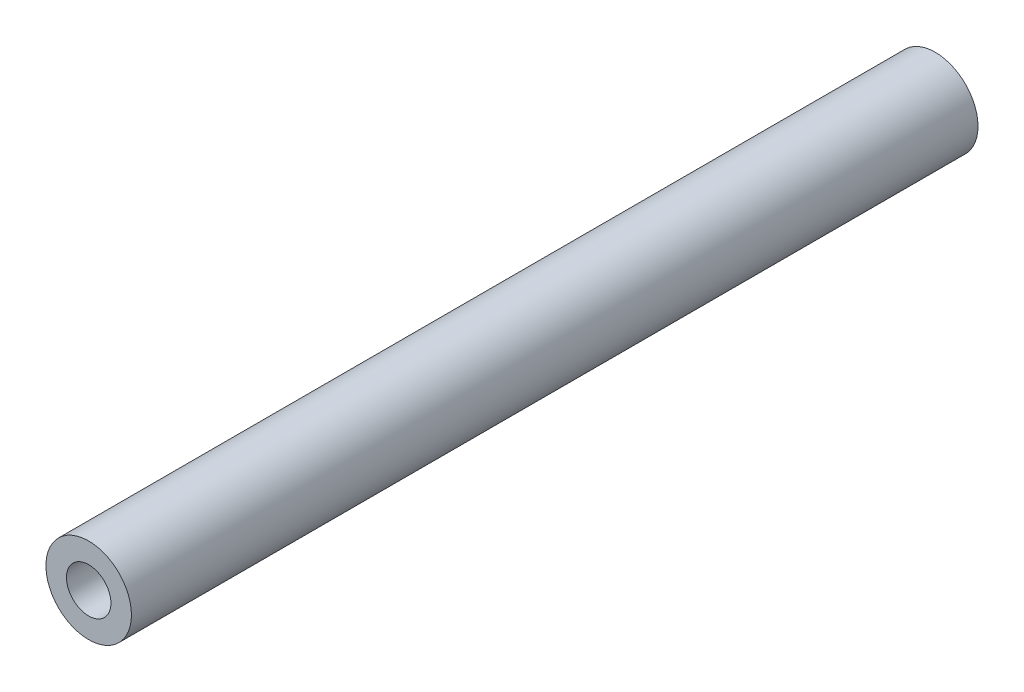
ISO-10303-21;
HEADER;
FILE_DESCRIPTION(('STEP AP214'),'2;1');
FILE_NAME('part.step','',(''),(''),'','','');
FILE_SCHEMA(('AUTOMOTIVE_DESIGN { 1 0 10303 214 1 1 1 1 }'));
ENDSEC;
DATA;
#1=APPLICATION_CONTEXT('core data for automotive mechanical design processes');
#2=APPLICATION_PROTOCOL_DEFINITION('international standard','automotive_design',2000,#1);
#3=PRODUCT_CONTEXT('',#1,'mechanical');
#4=PRODUCT('Part','Part','',(#3));
#5=PRODUCT_RELATED_PRODUCT_CATEGORY('part','',(#4));
#6=PRODUCT_DEFINITION_FORMATION('','',#4);
#7=PRODUCT_DEFINITION_CONTEXT('part definition',#1,'design');
#8=PRODUCT_DEFINITION('design','',#6,#7);
#9=PRODUCT_DEFINITION_SHAPE('','',#8);
#10=(LENGTH_UNIT() NAMED_UNIT(*) SI_UNIT(.MILLI.,.METRE.));
#11=(NAMED_UNIT(*) PLANE_ANGLE_UNIT() SI_UNIT($,.RADIAN.));
#12=(NAMED_UNIT(*) SI_UNIT($,.STERADIAN.) SOLID_ANGLE_UNIT());
#13=UNCERTAINTY_MEASURE_WITH_UNIT(LENGTH_MEASURE(1.E-05),#10,'distance_accuracy_value','');
#14=(GEOMETRIC_REPRESENTATION_CONTEXT(3) GLOBAL_UNCERTAINTY_ASSIGNED_CONTEXT((#13)) GLOBAL_UNIT_ASSIGNED_CONTEXT((#10,
#11,#12)) REPRESENTATION_CONTEXT('',''));
#15=CARTESIAN_POINT('',(0.,0.,0.));
#16=DIRECTION('',(0.,0.,1.));
#17=DIRECTION('',(1.,0.,0.));
#18=AXIS2_PLACEMENT_3D('',#15,#16,#17);
#19=CARTESIAN_POINT('',(0.,0.,49.5));
#20=DIRECTION('',(0.,0.,-1.));
#21=DIRECTION('',(-1.,0.,0.));
#22=AXIS2_PLACEMENT_3D('',#19,#20,#21);
#23=CYLINDRICAL_SURFACE('',#22,2.5);
#24=CARTESIAN_POINT('',(0.,0.,49.5));
#25=DIRECTION('',(0.,0.,1.));
#26=DIRECTION('',(1.,0.,0.));
#27=AXIS2_PLACEMENT_3D('',#24,#25,#26);
#28=CIRCLE('',#27,2.5);
#29=CARTESIAN_POINT('',(2.5,0.,49.5));
#30=VERTEX_POINT('',#29);
#31=EDGE_CURVE('E11',#30,#30,#28,.T.);
#32=ORIENTED_EDGE('',*,*,#31,.F.);
#33=EDGE_LOOP('',(#32));
#34=FACE_BOUND('',#33,.T.);
#35=CARTESIAN_POINT('',(0.,0.,0.));
#36=DIRECTION('',(0.,0.,1.));
#37=DIRECTION('',(1.,0.,0.));
#38=AXIS2_PLACEMENT_3D('',#35,#36,#37);
#39=CIRCLE('',#38,2.5);
#40=CARTESIAN_POINT('',(2.5,0.,0.));
#41=VERTEX_POINT('',#40);
#42=EDGE_CURVE('E52',#41,#41,#39,.T.);
#43=ORIENTED_EDGE('',*,*,#42,.T.);
#44=EDGE_LOOP('',(#43));
#45=FACE_BOUND('',#44,.T.);
#46=ADVANCED_FACE('F49',(#34,#45),#23,.T.);
#47=CARTESIAN_POINT('',(0.,0.,49.5));
#48=DIRECTION('',(0.,0.,1.));
#49=DIRECTION('',(1.,0.,0.));
#50=AXIS2_PLACEMENT_3D('',#47,#48,#49);
#51=PLANE('',#50);
#52=CARTESIAN_POINT('',(0.,0.,49.5));
#53=DIRECTION('',(0.,0.,1.));
#54=DIRECTION('',(1.,0.,0.));
#55=AXIS2_PLACEMENT_3D('',#52,#53,#54);
#56=CIRCLE('',#55,1.29999999999999);
#57=CARTESIAN_POINT('',(1.29999999999999,0.,49.5));
#58=VERTEX_POINT('',#57);
#59=EDGE_CURVE('E74',#58,#58,#56,.T.);
#60=ORIENTED_EDGE('',*,*,#59,.F.);
#61=EDGE_LOOP('',(#60));
#62=FACE_BOUND('',#61,.T.);
#63=ORIENTED_EDGE('',*,*,#31,.T.);
#64=EDGE_LOOP('',(#63));
#65=FACE_BOUND('',#64,.T.);
#66=ADVANCED_FACE('F97',(#62,#65),#51,.T.);
#67=CARTESIAN_POINT('',(0.,0.,0.));
#68=DIRECTION('',(0.,0.,1.));
#69=DIRECTION('',(1.,0.,0.));
#70=AXIS2_PLACEMENT_3D('',#67,#68,#69);
#71=PLANE('',#70);
#72=CARTESIAN_POINT('',(0.,0.,0.));
#73=DIRECTION('',(0.,0.,-1.));
#74=DIRECTION('',(-1.,0.,0.));
#75=AXIS2_PLACEMENT_3D('',#72,#73,#74);
#76=CIRCLE('',#75,1.29999999999999);
#77=CARTESIAN_POINT('',(-1.29999999999999,0.,0.));
#78=VERTEX_POINT('',#77);
#79=EDGE_CURVE('E75',#78,#78,#76,.T.);
#80=ORIENTED_EDGE('',*,*,#79,.F.);
#81=EDGE_LOOP('',(#80));
#82=FACE_BOUND('',#81,.T.);
#83=ORIENTED_EDGE('',*,*,#42,.F.);
#84=EDGE_LOOP('',(#83));
#85=FACE_BOUND('',#84,.T.);
#86=ADVANCED_FACE('F94',(#82,#85),#71,.F.);
#87=CARTESIAN_POINT('',(0.,0.,41.5));
#88=DIRECTION('',(0.,0.,1.));
#89=DIRECTION('',(1.,0.,0.));
#90=AXIS2_PLACEMENT_3D('',#87,#88,#89);
#91=CONICAL_SURFACE('',#90,1.29999999999999,1.02974425867665);
#92=CARTESIAN_POINT('',(0.,0.,40.7188811952642));
#93=VERTEX_POINT('',#92);
#94=VERTEX_LOOP('',#93);
#95=FACE_BOUND('',#94,.T.);
#96=CARTESIAN_POINT('',(0.,0.,41.5));
#97=DIRECTION('',(0.,0.,1.));
#98=DIRECTION('',(1.,0.,0.));
#99=AXIS2_PLACEMENT_3D('',#96,#97,#98);
#100=CIRCLE('',#99,1.29999999999999);
#101=CARTESIAN_POINT('',(1.29999999999999,0.,41.5));
#102=VERTEX_POINT('',#101);
#103=EDGE_CURVE('E80',#102,#102,#100,.T.);
#104=ORIENTED_EDGE('',*,*,#103,.T.);
#105=EDGE_LOOP('',(#104));
#106=FACE_BOUND('',#105,.T.);
#107=ADVANCED_FACE('F96',(#95,#106),#91,.F.);
#108=CARTESIAN_POINT('',(0.,0.,49.5));
#109=DIRECTION('',(0.,0.,1.));
#110=DIRECTION('',(1.,0.,0.));
#111=AXIS2_PLACEMENT_3D('',#108,#109,#110);
#112=CYLINDRICAL_SURFACE('',#111,1.29999999999999);
#113=ORIENTED_EDGE('',*,*,#103,.F.);
#114=EDGE_LOOP('',(#113));
#115=FACE_BOUND('',#114,.T.);
#116=ORIENTED_EDGE('',*,*,#59,.T.);
#117=EDGE_LOOP('',(#116));
#118=FACE_BOUND('',#117,.T.);
#119=ADVANCED_FACE('F67',(#115,#118),#112,.F.);
#120=CARTESIAN_POINT('',(0.,0.,7.99999999999999));
#121=DIRECTION('',(0.,0.,-1.));
#122=DIRECTION('',(-1.,0.,0.));
#123=AXIS2_PLACEMENT_3D('',#120,#121,#122);
#124=CONICAL_SURFACE('',#123,1.29999999999999,1.02974425867665);
#125=CARTESIAN_POINT('',(0.,0.,8.78111880473583));
#126=VERTEX_POINT('',#125);
#127=VERTEX_LOOP('',#126);
#128=FACE_BOUND('',#127,.T.);
#129=CARTESIAN_POINT('',(0.,0.,7.99999999999999));
#130=DIRECTION('',(0.,0.,-1.));
#131=DIRECTION('',(-1.,0.,0.));
#132=AXIS2_PLACEMENT_3D('',#129,#130,#131);
#133=CIRCLE('',#132,1.29999999999999);
#134=CARTESIAN_POINT('',(-1.29999999999999,0.,7.99999999999999));
#135=VERTEX_POINT('',#134);
#136=EDGE_CURVE('E71',#135,#135,#133,.T.);
#137=ORIENTED_EDGE('',*,*,#136,.T.);
#138=EDGE_LOOP('',(#137));
#139=FACE_BOUND('',#138,.T.);
#140=ADVANCED_FACE('F63',(#128,#139),#124,.F.);
#141=CARTESIAN_POINT('',(0.,0.,0.));
#142=DIRECTION('',(0.,0.,-1.));
#143=DIRECTION('',(-1.,0.,0.));
#144=AXIS2_PLACEMENT_3D('',#141,#142,#143);
#145=CYLINDRICAL_SURFACE('',#144,1.29999999999999);
#146=ORIENTED_EDGE('',*,*,#136,.F.);
#147=EDGE_LOOP('',(#146));
#148=FACE_BOUND('',#147,.T.);
#149=ORIENTED_EDGE('',*,*,#79,.T.);
#150=EDGE_LOOP('',(#149));
#151=FACE_BOUND('',#150,.T.);
#152=ADVANCED_FACE('F66',(#148,#151),#145,.F.);
#153=CLOSED_SHELL('',(#46,#66,#86,#107,#119,#140,#152));
#154=MANIFOLD_SOLID_BREP('B2',#153);
#155=ADVANCED_BREP_SHAPE_REPRESENTATION('',(#18,#154),#14);
#156=SHAPE_DEFINITION_REPRESENTATION(#9,#155);
ENDSEC;
END-ISO-10303-21;
